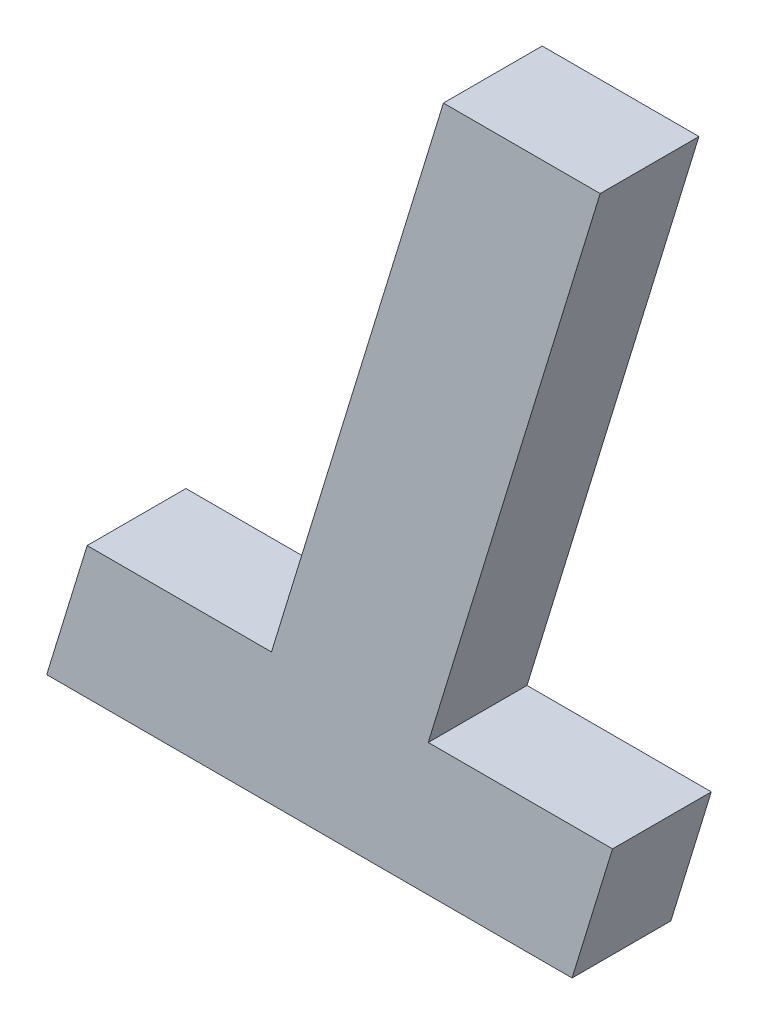
ISO-10303-21;
HEADER;
FILE_DESCRIPTION(('STEP AP214'),'2;1');
FILE_NAME('part.step','',(''),(''),'','','');
FILE_SCHEMA(('AUTOMOTIVE_DESIGN { 1 0 10303 214 1 1 1 1 }'));
ENDSEC;
DATA;
#1=APPLICATION_CONTEXT('core data for automotive mechanical design processes');
#2=APPLICATION_PROTOCOL_DEFINITION('international standard','automotive_design',2000,#1);
#3=PRODUCT_CONTEXT('',#1,'mechanical');
#4=PRODUCT('Part','Part','',(#3));
#5=PRODUCT_RELATED_PRODUCT_CATEGORY('part','',(#4));
#6=PRODUCT_DEFINITION_FORMATION('','',#4);
#7=PRODUCT_DEFINITION_CONTEXT('part definition',#1,'design');
#8=PRODUCT_DEFINITION('design','',#6,#7);
#9=PRODUCT_DEFINITION_SHAPE('','',#8);
#10=(LENGTH_UNIT() NAMED_UNIT(*) SI_UNIT(.MILLI.,.METRE.));
#11=(NAMED_UNIT(*) PLANE_ANGLE_UNIT() SI_UNIT($,.RADIAN.));
#12=(NAMED_UNIT(*) SI_UNIT($,.STERADIAN.) SOLID_ANGLE_UNIT());
#13=UNCERTAINTY_MEASURE_WITH_UNIT(LENGTH_MEASURE(1.E-05),#10,'distance_accuracy_value','');
#14=(GEOMETRIC_REPRESENTATION_CONTEXT(3) GLOBAL_UNCERTAINTY_ASSIGNED_CONTEXT((#13)) GLOBAL_UNIT_ASSIGNED_CONTEXT((#10,
#11,#12)) REPRESENTATION_CONTEXT('',''));
#15=CARTESIAN_POINT('',(0.,0.,0.));
#16=DIRECTION('',(0.,0.,1.));
#17=DIRECTION('',(1.,0.,0.));
#18=AXIS2_PLACEMENT_3D('',#15,#16,#17);
#19=CARTESIAN_POINT('',(6.4435866304391,0.844007334933629,0.));
#20=DIRECTION('',(0.,1.,0.));
#21=DIRECTION('',(-1.,0.,0.));
#22=AXIS2_PLACEMENT_3D('',#19,#20,#21);
#23=PLANE('',#22);
#24=DIRECTION('',(1.,0.,0.));
#25=VECTOR('',#24,1.);
#26=CARTESIAN_POINT('',(6.2569934277794,0.844007334933629,0.));
#27=LINE('',#26,#25);
#28=CARTESIAN_POINT('',(6.2569934277794,0.844007334933629,0.));
#29=VERTEX_POINT('',#28);
#30=CARTESIAN_POINT('',(6.4435866304391,0.844007334933629,0.));
#31=VERTEX_POINT('',#30);
#32=EDGE_CURVE('E11',#29,#31,#27,.T.);
#33=ORIENTED_EDGE('',*,*,#32,.F.);
#34=DIRECTION('',(0.,0.,1.));
#35=VECTOR('',#34,1.);
#36=CARTESIAN_POINT('',(6.2569934277794,0.844007334933629,0.));
#37=LINE('',#36,#35);
#38=CARTESIAN_POINT('',(6.2569934277794,0.844007334933629,0.1));
#39=VERTEX_POINT('',#38);
#40=EDGE_CURVE('E24',#29,#39,#37,.T.);
#41=ORIENTED_EDGE('',*,*,#40,.T.);
#42=DIRECTION('',(-1.,0.,0.));
#43=VECTOR('',#42,1.);
#44=CARTESIAN_POINT('',(6.2569934277794,0.844007334933629,0.1));
#45=LINE('',#44,#43);
#46=CARTESIAN_POINT('',(6.4435866304391,0.844007334933629,0.1));
#47=VERTEX_POINT('',#46);
#48=EDGE_CURVE('E100',#47,#39,#45,.T.);
#49=ORIENTED_EDGE('',*,*,#48,.F.);
#50=DIRECTION('',(0.,0.,1.));
#51=VECTOR('',#50,1.);
#52=CARTESIAN_POINT('',(6.4435866304391,0.844007334933629,0.));
#53=LINE('',#52,#51);
#54=EDGE_CURVE('E141',#31,#47,#53,.T.);
#55=ORIENTED_EDGE('',*,*,#54,.F.);
#56=EDGE_LOOP('',(#33,#41,#49,#55));
#57=FACE_BOUND('',#56,.T.);
#58=ADVANCED_FACE('F17',(#57),#23,.T.);
#59=CARTESIAN_POINT('',(6.4026271469284,0.710320131808521,0.));
#60=DIRECTION('',(0.956130206843128,-0.292942020820019,0.));
#61=DIRECTION('',(0.292942020820019,0.956130206843128,0.));
#62=AXIS2_PLACEMENT_3D('',#59,#60,#61);
#63=PLANE('',#62);
#64=DIRECTION('',(-0.292942020820019,-0.956130206843128,0.));
#65=VECTOR('',#64,1.);
#66=CARTESIAN_POINT('',(6.4435866304391,0.844007334933629,0.));
#67=LINE('',#66,#65);
#68=CARTESIAN_POINT('',(6.4026271469284,0.710320131808521,0.));
#69=VERTEX_POINT('',#68);
#70=EDGE_CURVE('E139',#31,#69,#67,.T.);
#71=ORIENTED_EDGE('',*,*,#70,.F.);
#72=ORIENTED_EDGE('',*,*,#54,.T.);
#73=DIRECTION('',(0.292942020820019,0.956130206843128,0.));
#74=VECTOR('',#73,1.);
#75=CARTESIAN_POINT('',(6.4435866304391,0.844007334933629,0.1));
#76=LINE('',#75,#74);
#77=CARTESIAN_POINT('',(6.4026271469284,0.710320131808521,0.1));
#78=VERTEX_POINT('',#77);
#79=EDGE_CURVE('E137',#78,#47,#76,.T.);
#80=ORIENTED_EDGE('',*,*,#79,.F.);
#81=DIRECTION('',(0.,0.,1.));
#82=VECTOR('',#81,1.);
#83=CARTESIAN_POINT('',(6.4026271469284,0.710320131808521,0.));
#84=LINE('',#83,#82);
#85=EDGE_CURVE('E134',#69,#78,#84,.T.);
#86=ORIENTED_EDGE('',*,*,#85,.F.);
#87=EDGE_LOOP('',(#71,#72,#80,#86));
#88=FACE_BOUND('',#87,.T.);
#89=ADVANCED_FACE('F163',(#88),#63,.T.);
#90=CARTESIAN_POINT('',(5.8707227430051,0.710320131808521,0.));
#91=DIRECTION('',(0.,-1.,0.));
#92=DIRECTION('',(1.,0.,0.));
#93=AXIS2_PLACEMENT_3D('',#90,#91,#92);
#94=PLANE('',#93);
#95=DIRECTION('',(-1.,0.,0.));
#96=VECTOR('',#95,1.);
#97=CARTESIAN_POINT('',(6.4026271469284,0.710320131808521,0.));
#98=LINE('',#97,#96);
#99=CARTESIAN_POINT('',(5.8707227430051,0.710320131808521,0.));
#100=VERTEX_POINT('',#99);
#101=EDGE_CURVE('E132',#69,#100,#98,.T.);
#102=ORIENTED_EDGE('',*,*,#101,.F.);
#103=ORIENTED_EDGE('',*,*,#85,.T.);
#104=DIRECTION('',(1.,0.,0.));
#105=VECTOR('',#104,1.);
#106=CARTESIAN_POINT('',(6.4026271469284,0.710320131808521,0.1));
#107=LINE('',#106,#105);
#108=CARTESIAN_POINT('',(5.8707227430051,0.710320131808521,0.1));
#109=VERTEX_POINT('',#108);
#110=EDGE_CURVE('E129',#109,#78,#107,.T.);
#111=ORIENTED_EDGE('',*,*,#110,.F.);
#112=DIRECTION('',(0.,0.,1.));
#113=VECTOR('',#112,1.);
#114=CARTESIAN_POINT('',(5.8707227430051,0.710320131808521,0.));
#115=LINE('',#114,#113);
#116=EDGE_CURVE('E126',#100,#109,#115,.T.);
#117=ORIENTED_EDGE('',*,*,#116,.F.);
#118=EDGE_LOOP('',(#102,#103,#111,#117));
#119=FACE_BOUND('',#118,.T.);
#120=ADVANCED_FACE('F159',(#119),#94,.T.);
#121=CARTESIAN_POINT('',(5.9116822265158,0.844007334933629,0.));
#122=DIRECTION('',(-0.956130206843126,0.292942020820027,0.));
#123=DIRECTION('',(-0.292942020820027,-0.956130206843126,0.));
#124=AXIS2_PLACEMENT_3D('',#121,#122,#123);
#125=PLANE('',#124);
#126=DIRECTION('',(0.292942020820027,0.956130206843126,0.));
#127=VECTOR('',#126,1.);
#128=CARTESIAN_POINT('',(5.8707227430051,0.710320131808521,0.));
#129=LINE('',#128,#127);
#130=CARTESIAN_POINT('',(5.9116822265158,0.844007334933629,0.));
#131=VERTEX_POINT('',#130);
#132=EDGE_CURVE('E124',#100,#131,#129,.T.);
#133=ORIENTED_EDGE('',*,*,#132,.F.);
#134=ORIENTED_EDGE('',*,*,#116,.T.);
#135=DIRECTION('',(-0.292942020820027,-0.956130206843126,0.));
#136=VECTOR('',#135,1.);
#137=CARTESIAN_POINT('',(5.8707227430051,0.710320131808521,0.1));
#138=LINE('',#137,#136);
#139=CARTESIAN_POINT('',(5.9116822265158,0.844007334933629,0.1));
#140=VERTEX_POINT('',#139);
#141=EDGE_CURVE('E121',#140,#109,#138,.T.);
#142=ORIENTED_EDGE('',*,*,#141,.F.);
#143=DIRECTION('',(0.,0.,1.));
#144=VECTOR('',#143,1.);
#145=CARTESIAN_POINT('',(5.9116822265158,0.844007334933629,0.));
#146=LINE('',#145,#144);
#147=EDGE_CURVE('E118',#131,#140,#146,.T.);
#148=ORIENTED_EDGE('',*,*,#147,.F.);
#149=EDGE_LOOP('',(#133,#134,#142,#148));
#150=FACE_BOUND('',#149,.T.);
#151=ADVANCED_FACE('F155',(#150),#125,.T.);
#152=CARTESIAN_POINT('',(6.0982754291755,0.844007334933629,0.));
#153=DIRECTION('',(0.,1.,0.));
#154=DIRECTION('',(-1.,0.,0.));
#155=AXIS2_PLACEMENT_3D('',#152,#153,#154);
#156=PLANE('',#155);
#157=DIRECTION('',(1.,0.,0.));
#158=VECTOR('',#157,1.);
#159=CARTESIAN_POINT('',(5.9116822265158,0.844007334933629,0.));
#160=LINE('',#159,#158);
#161=CARTESIAN_POINT('',(6.0982754291755,0.844007334933629,0.));
#162=VERTEX_POINT('',#161);
#163=EDGE_CURVE('E116',#131,#162,#160,.T.);
#164=ORIENTED_EDGE('',*,*,#163,.F.);
#165=ORIENTED_EDGE('',*,*,#147,.T.);
#166=DIRECTION('',(-1.,0.,0.));
#167=VECTOR('',#166,1.);
#168=CARTESIAN_POINT('',(5.9116822265158,0.844007334933629,0.1));
#169=LINE('',#168,#167);
#170=CARTESIAN_POINT('',(6.0982754291755,0.844007334933629,0.1));
#171=VERTEX_POINT('',#170);
#172=EDGE_CURVE('E113',#171,#140,#169,.T.);
#173=ORIENTED_EDGE('',*,*,#172,.F.);
#174=DIRECTION('',(0.,0.,1.));
#175=VECTOR('',#174,1.);
#176=CARTESIAN_POINT('',(6.0982754291755,0.844007334933629,0.));
#177=LINE('',#176,#175);
#178=EDGE_CURVE('E110',#162,#171,#177,.T.);
#179=ORIENTED_EDGE('',*,*,#178,.F.);
#180=EDGE_LOOP('',(#164,#165,#173,#179));
#181=FACE_BOUND('',#180,.T.);
#182=ADVANCED_FACE('F151',(#181),#156,.T.);
#183=CARTESIAN_POINT('',(6.2723532340959,1.4123201686442,0.));
#184=DIRECTION('',(-0.956150738053338,0.292875000845167,0.));
#185=DIRECTION('',(-0.292875000845167,-0.956150738053338,0.));
#186=AXIS2_PLACEMENT_3D('',#183,#184,#185);
#187=PLANE('',#186);
#188=DIRECTION('',(0.292875000845167,0.956150738053338,0.));
#189=VECTOR('',#188,1.);
#190=CARTESIAN_POINT('',(6.0982754291755,0.844007334933629,0.));
#191=LINE('',#190,#189);
#192=CARTESIAN_POINT('',(6.2723532340959,1.4123201686442,0.));
#193=VERTEX_POINT('',#192);
#194=EDGE_CURVE('E108',#162,#193,#191,.T.);
#195=ORIENTED_EDGE('',*,*,#194,.F.);
#196=ORIENTED_EDGE('',*,*,#178,.T.);
#197=DIRECTION('',(-0.292875000845167,-0.956150738053338,0.));
#198=VECTOR('',#197,1.);
#199=CARTESIAN_POINT('',(6.0982754291755,0.844007334933629,0.1));
#200=LINE('',#199,#198);
#201=CARTESIAN_POINT('',(6.2723532340959,1.4123201686442,0.1));
#202=VERTEX_POINT('',#201);
#203=EDGE_CURVE('E106',#202,#171,#200,.T.);
#204=ORIENTED_EDGE('',*,*,#203,.F.);
#205=DIRECTION('',(0.,0.,1.));
#206=VECTOR('',#205,1.);
#207=CARTESIAN_POINT('',(6.2723532340959,1.4123201686442,0.));
#208=LINE('',#207,#206);
#209=EDGE_CURVE('E85',#193,#202,#208,.T.);
#210=ORIENTED_EDGE('',*,*,#209,.F.);
#211=EDGE_LOOP('',(#195,#196,#204,#210));
#212=FACE_BOUND('',#211,.T.);
#213=ADVANCED_FACE('F149',(#212),#187,.T.);
#214=CARTESIAN_POINT('',(6.4310712326997,1.4123201686442,0.));
#215=DIRECTION('',(0.,1.,0.));
#216=DIRECTION('',(-1.,0.,0.));
#217=AXIS2_PLACEMENT_3D('',#214,#215,#216);
#218=PLANE('',#217);
#219=DIRECTION('',(1.,0.,0.));
#220=VECTOR('',#219,1.);
#221=CARTESIAN_POINT('',(6.2723532340959,1.4123201686442,0.));
#222=LINE('',#221,#220);
#223=CARTESIAN_POINT('',(6.4310712326997,1.4123201686442,0.));
#224=VERTEX_POINT('',#223);
#225=EDGE_CURVE('E89',#193,#224,#222,.T.);
#226=ORIENTED_EDGE('',*,*,#225,.F.);
#227=ORIENTED_EDGE('',*,*,#209,.T.);
#228=DIRECTION('',(-1.,0.,0.));
#229=VECTOR('',#228,1.);
#230=CARTESIAN_POINT('',(6.2723532340959,1.4123201686442,0.1));
#231=LINE('',#230,#229);
#232=CARTESIAN_POINT('',(6.4310712326997,1.4123201686442,0.1));
#233=VERTEX_POINT('',#232);
#234=EDGE_CURVE('E78',#233,#202,#231,.T.);
#235=ORIENTED_EDGE('',*,*,#234,.F.);
#236=DIRECTION('',(0.,0.,1.));
#237=VECTOR('',#236,1.);
#238=CARTESIAN_POINT('',(6.4310712326997,1.4123201686442,0.));
#239=LINE('',#238,#237);
#240=EDGE_CURVE('E82',#224,#233,#239,.T.);
#241=ORIENTED_EDGE('',*,*,#240,.F.);
#242=EDGE_LOOP('',(#226,#227,#235,#241));
#243=FACE_BOUND('',#242,.T.);
#244=ADVANCED_FACE('F81',(#243),#218,.T.);
#245=CARTESIAN_POINT('',(6.2569934277794,0.844007334933629,0.));
#246=DIRECTION('',(0.956150738053338,-0.292875000845167,0.));
#247=DIRECTION('',(0.292875000845167,0.956150738053338,0.));
#248=AXIS2_PLACEMENT_3D('',#245,#246,#247);
#249=PLANE('',#248);
#250=DIRECTION('',(-0.292875000845167,-0.956150738053338,0.));
#251=VECTOR('',#250,1.);
#252=CARTESIAN_POINT('',(6.4310712326997,1.4123201686442,0.));
#253=LINE('',#252,#251);
#254=EDGE_CURVE('E95',#224,#29,#253,.T.);
#255=ORIENTED_EDGE('',*,*,#254,.F.);
#256=ORIENTED_EDGE('',*,*,#240,.T.);
#257=DIRECTION('',(0.292875000845167,0.956150738053338,0.));
#258=VECTOR('',#257,1.);
#259=CARTESIAN_POINT('',(6.4310712326997,1.4123201686442,0.1));
#260=LINE('',#259,#258);
#261=EDGE_CURVE('E94',#39,#233,#260,.T.);
#262=ORIENTED_EDGE('',*,*,#261,.F.);
#263=ORIENTED_EDGE('',*,*,#40,.F.);
#264=EDGE_LOOP('',(#255,#256,#262,#263));
#265=FACE_BOUND('',#264,.T.);
#266=ADVANCED_FACE('F93',(#265),#249,.T.);
#267=CARTESIAN_POINT('',(6.2185408628577,0.977563688885655,0.));
#268=DIRECTION('',(0.,0.,1.));
#269=DIRECTION('',(1.,0.,0.));
#270=AXIS2_PLACEMENT_3D('',#267,#268,#269);
#271=PLANE('',#270);
#272=ORIENTED_EDGE('',*,*,#254,.T.);
#273=ORIENTED_EDGE('',*,*,#32,.T.);
#274=ORIENTED_EDGE('',*,*,#70,.T.);
#275=ORIENTED_EDGE('',*,*,#101,.T.);
#276=ORIENTED_EDGE('',*,*,#132,.T.);
#277=ORIENTED_EDGE('',*,*,#163,.T.);
#278=ORIENTED_EDGE('',*,*,#194,.T.);
#279=ORIENTED_EDGE('',*,*,#225,.T.);
#280=EDGE_LOOP('',(#272,#273,#274,#275,#276,#277,#278,#279));
#281=FACE_BOUND('',#280,.T.);
#282=ADVANCED_FACE('F144',(#281),#271,.F.);
#283=CARTESIAN_POINT('',(6.2185408628577,0.977563688885655,0.1));
#284=DIRECTION('',(0.,0.,1.));
#285=DIRECTION('',(1.,0.,0.));
#286=AXIS2_PLACEMENT_3D('',#283,#284,#285);
#287=PLANE('',#286);
#288=ORIENTED_EDGE('',*,*,#261,.T.);
#289=ORIENTED_EDGE('',*,*,#234,.T.);
#290=ORIENTED_EDGE('',*,*,#203,.T.);
#291=ORIENTED_EDGE('',*,*,#172,.T.);
#292=ORIENTED_EDGE('',*,*,#141,.T.);
#293=ORIENTED_EDGE('',*,*,#110,.T.);
#294=ORIENTED_EDGE('',*,*,#79,.T.);
#295=ORIENTED_EDGE('',*,*,#48,.T.);
#296=EDGE_LOOP('',(#288,#289,#290,#291,#292,#293,#294,#295));
#297=FACE_BOUND('',#296,.T.);
#298=ADVANCED_FACE('F98',(#297),#287,.T.);
#299=CLOSED_SHELL('',(#58,#89,#120,#151,#182,#213,#244,#266,#282,#298));
#300=MANIFOLD_SOLID_BREP('B1',#299);
#301=ADVANCED_BREP_SHAPE_REPRESENTATION('',(#18,#300),#14);
#302=SHAPE_DEFINITION_REPRESENTATION(#9,#301);
ENDSEC;
END-ISO-10303-21;
